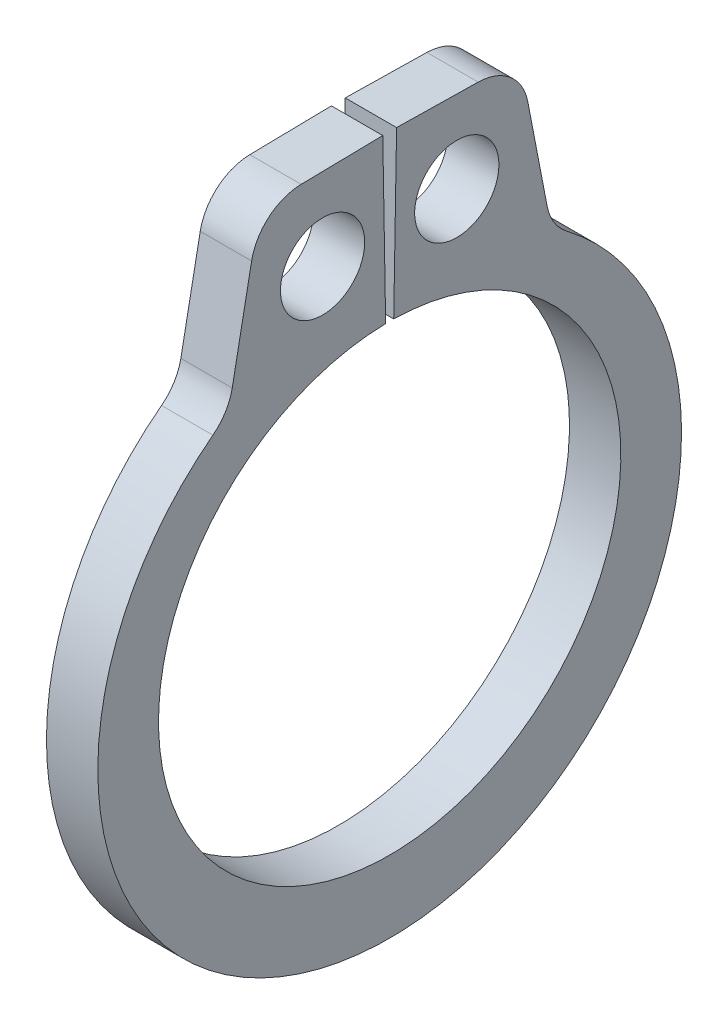
ISO-10303-21;
HEADER;
FILE_DESCRIPTION(('STEP AP214'),'2;1');
FILE_NAME('part.step','',(''),(''),'','','');
FILE_SCHEMA(('AUTOMOTIVE_DESIGN { 1 0 10303 214 1 1 1 1 }'));
ENDSEC;
DATA;
#1=APPLICATION_CONTEXT('core data for automotive mechanical design processes');
#2=APPLICATION_PROTOCOL_DEFINITION('international standard','automotive_design',2000,#1);
#3=PRODUCT_CONTEXT('',#1,'mechanical');
#4=PRODUCT('Part','Part','',(#3));
#5=PRODUCT_RELATED_PRODUCT_CATEGORY('part','',(#4));
#6=PRODUCT_DEFINITION_FORMATION('','',#4);
#7=PRODUCT_DEFINITION_CONTEXT('part definition',#1,'design');
#8=PRODUCT_DEFINITION('design','',#6,#7);
#9=PRODUCT_DEFINITION_SHAPE('','',#8);
#10=(LENGTH_UNIT() NAMED_UNIT(*) SI_UNIT(.MILLI.,.METRE.));
#11=(NAMED_UNIT(*) PLANE_ANGLE_UNIT() SI_UNIT($,.RADIAN.));
#12=(NAMED_UNIT(*) SI_UNIT($,.STERADIAN.) SOLID_ANGLE_UNIT());
#13=UNCERTAINTY_MEASURE_WITH_UNIT(LENGTH_MEASURE(1.E-05),#10,'distance_accuracy_value','');
#14=(GEOMETRIC_REPRESENTATION_CONTEXT(3) GLOBAL_UNCERTAINTY_ASSIGNED_CONTEXT((#13)) GLOBAL_UNIT_ASSIGNED_CONTEXT((#10,
#11,#12)) REPRESENTATION_CONTEXT('',''));
#15=CARTESIAN_POINT('',(0.,0.,0.));
#16=DIRECTION('',(0.,0.,1.));
#17=DIRECTION('',(1.,0.,0.));
#18=AXIS2_PLACEMENT_3D('',#15,#16,#17);
#19=CARTESIAN_POINT('',(0.3175,0.,0.));
#20=DIRECTION('',(1.,0.,0.));
#21=DIRECTION('',(0.,0.,-1.));
#22=AXIS2_PLACEMENT_3D('',#19,#20,#21);
#23=PLANE('',#22);
#24=CARTESIAN_POINT('',(0.3175,3.85961131348307,0.829485840043988));
#25=DIRECTION('',(1.,0.,0.));
#26=DIRECTION('',(0.,0.,-1.));
#27=AXIS2_PLACEMENT_3D('',#24,#25,#26);
#28=CIRCLE('',#27,0.5207);
#29=CARTESIAN_POINT('',(0.3175,3.85961131348307,0.308785840043987));
#30=VERTEX_POINT('',#29);
#31=EDGE_CURVE('E283',#30,#30,#28,.T.);
#32=ORIENTED_EDGE('',*,*,#31,.F.);
#33=EDGE_LOOP('',(#32));
#34=FACE_BOUND('',#33,.T.);
#35=DIRECTION('',(0.,-0.017452406437284,0.999847695156391));
#36=VECTOR('',#35,1.);
#37=CARTESIAN_POINT('',(0.3175,4.88875530546717,0.0853335412750982));
#38=LINE('',#37,#36);
#39=CARTESIAN_POINT('',(0.3175,4.88875530546717,0.0853335412750982));
#40=VERTEX_POINT('',#39);
#41=CARTESIAN_POINT('',(0.3175,4.87114314790032,1.09433337251506));
#42=VERTEX_POINT('',#41);
#43=EDGE_CURVE('E168',#40,#42,#38,.T.);
#44=ORIENTED_EDGE('',*,*,#43,.T.);
#45=CARTESIAN_POINT('',(0.3175,4.23623986147601,1.08325109442739));
#46=DIRECTION('',(1.,0.,0.));
#47=DIRECTION('',(0.,0.,-1.));
#48=AXIS2_PLACEMENT_3D('',#45,#46,#47);
#49=CIRCLE('',#48,0.635);
#50=CARTESIAN_POINT('',(0.3175,4.3566525704861,1.7067298667275));
#51=VERTEX_POINT('',#50);
#52=EDGE_CURVE('E224',#42,#51,#49,.T.);
#53=ORIENTED_EDGE('',*,*,#52,.T.);
#54=DIRECTION('',(0.,-0.981856334330881,0.189626313401714));
#55=VECTOR('',#54,1.);
#56=CARTESIAN_POINT('',(0.3175,4.86215783805675,1.60910142869344));
#57=LINE('',#56,#55);
#58=CARTESIAN_POINT('',(0.3175,3.11622073770559,1.94629497136839));
#59=VERTEX_POINT('',#58);
#60=EDGE_CURVE('E273',#51,#59,#57,.T.);
#61=ORIENTED_EDGE('',*,*,#60,.T.);
#62=CARTESIAN_POINT('',(0.3175,3.23663344671568,2.5697737436685));
#63=DIRECTION('',(1.,0.,0.));
#64=DIRECTION('',(0.,0.,-1.));
#65=AXIS2_PLACEMENT_3D('',#62,#63,#64);
#66=CIRCLE('',#65,0.635);
#67=CARTESIAN_POINT('',(0.3175,2.73137951372646,2.18513954966213));
#68=VERTEX_POINT('',#67);
#69=EDGE_CURVE('E234',#59,#68,#66,.F.);
#70=ORIENTED_EDGE('',*,*,#69,.T.);
#71=CARTESIAN_POINT('',(0.3175,-0.139011025651335,0.));
#72=DIRECTION('',(1.,0.,0.));
#73=DIRECTION('',(0.,0.,-1.));
#74=AXIS2_PLACEMENT_3D('',#71,#72,#73);
#75=CIRCLE('',#74,3.60748897434866);
#76=CARTESIAN_POINT('',(0.3175,2.73137951372646,-2.18513954966213));
#77=VERTEX_POINT('',#76);
#78=EDGE_CURVE('E262',#68,#77,#75,.T.);
#79=ORIENTED_EDGE('',*,*,#78,.T.);
#80=CARTESIAN_POINT('',(0.3175,3.23663344671568,-2.5697737436685));
#81=DIRECTION('',(1.,0.,0.));
#82=DIRECTION('',(0.,0.,-1.));
#83=AXIS2_PLACEMENT_3D('',#80,#81,#82);
#84=CIRCLE('',#83,0.635);
#85=CARTESIAN_POINT('',(0.3175,3.11622073770559,-1.94629497136839));
#86=VERTEX_POINT('',#85);
#87=EDGE_CURVE('E11',#77,#86,#84,.F.);
#88=ORIENTED_EDGE('',*,*,#87,.T.);
#89=DIRECTION('',(0.,0.981856334330881,0.189626313401714));
#90=VECTOR('',#89,1.);
#91=CARTESIAN_POINT('',(0.3175,4.86215783805675,-1.60910142869344));
#92=LINE('',#91,#90);
#93=CARTESIAN_POINT('',(0.3175,4.3566525704861,-1.7067298667275));
#94=VERTEX_POINT('',#93);
#95=EDGE_CURVE('E261',#86,#94,#92,.T.);
#96=ORIENTED_EDGE('',*,*,#95,.T.);
#97=CARTESIAN_POINT('',(0.3175,4.23623986147601,-1.08325109442739));
#98=DIRECTION('',(1.,0.,0.));
#99=DIRECTION('',(0.,0.,-1.));
#100=AXIS2_PLACEMENT_3D('',#97,#98,#99);
#101=CIRCLE('',#100,0.635);
#102=CARTESIAN_POINT('',(0.3175,4.87114314790032,-1.09433337251506));
#103=VERTEX_POINT('',#102);
#104=EDGE_CURVE('E62',#94,#103,#101,.T.);
#105=ORIENTED_EDGE('',*,*,#104,.T.);
#106=DIRECTION('',(0.,0.017452406437284,0.999847695156391));
#107=VECTOR('',#106,1.);
#108=CARTESIAN_POINT('',(0.3175,4.88875530546717,-0.0853335412750982));
#109=LINE('',#108,#107);
#110=CARTESIAN_POINT('',(0.3175,4.88875530546717,-0.0853335412750982));
#111=VERTEX_POINT('',#110);
#112=EDGE_CURVE('E267',#103,#111,#109,.T.);
#113=ORIENTED_EDGE('',*,*,#112,.T.);
#114=DIRECTION('',(0.,-0.999847695156391,0.0174524064372836));
#115=VECTOR('',#114,1.);
#116=CARTESIAN_POINT('',(0.3175,2.85706478890939,-0.0498702513945379));
#117=LINE('',#116,#115);
#118=CARTESIAN_POINT('',(0.3175,2.85706478890939,-0.0498702513945379));
#119=VERTEX_POINT('',#118);
#120=EDGE_CURVE('E174',#111,#119,#117,.T.);
#121=ORIENTED_EDGE('',*,*,#120,.T.);
#122=CARTESIAN_POINT('',(0.3175,0.,0.));
#123=DIRECTION('',(-1.,0.,0.));
#124=DIRECTION('',(0.,0.,-1.));
#125=AXIS2_PLACEMENT_3D('',#122,#123,#124);
#126=CIRCLE('',#125,2.8575);
#127=CARTESIAN_POINT('',(0.3175,2.85706478890939,0.0498702513945379));
#128=VERTEX_POINT('',#127);
#129=EDGE_CURVE('E169',#119,#128,#126,.T.);
#130=ORIENTED_EDGE('',*,*,#129,.T.);
#131=DIRECTION('',(0.,0.999847695156391,0.0174524064372836));
#132=VECTOR('',#131,1.);
#133=CARTESIAN_POINT('',(0.3175,2.85706478890939,0.0498702513945379));
#134=LINE('',#133,#132);
#135=EDGE_CURVE('E159',#128,#40,#134,.T.);
#136=ORIENTED_EDGE('',*,*,#135,.T.);
#137=EDGE_LOOP('',(#44,#53,#61,#70,#79,#88,#96,#105,#113,#121,#130,#136));
#138=FACE_BOUND('',#137,.T.);
#139=CARTESIAN_POINT('',(0.3175,3.85961131348307,-0.829485840043988));
#140=DIRECTION('',(1.,0.,0.));
#141=DIRECTION('',(0.,0.,-1.));
#142=AXIS2_PLACEMENT_3D('',#139,#140,#141);
#143=CIRCLE('',#142,0.5207);
#144=CARTESIAN_POINT('',(0.3175,3.85961131348307,-1.35018584004399));
#145=VERTEX_POINT('',#144);
#146=EDGE_CURVE('E318',#145,#145,#143,.T.);
#147=ORIENTED_EDGE('',*,*,#146,.F.);
#148=EDGE_LOOP('',(#147));
#149=FACE_BOUND('',#148,.T.);
#150=ADVANCED_FACE('F43',(#34,#138,#149),#23,.T.);
#151=CARTESIAN_POINT('',(-0.3175,0.,0.));
#152=DIRECTION('',(1.,0.,0.));
#153=DIRECTION('',(0.,0.,-1.));
#154=AXIS2_PLACEMENT_3D('',#151,#152,#153);
#155=PLANE('',#154);
#156=CARTESIAN_POINT('',(-0.3175,3.85961131348307,0.829485840043988));
#157=DIRECTION('',(1.,0.,0.));
#158=DIRECTION('',(0.,0.,-1.));
#159=AXIS2_PLACEMENT_3D('',#156,#157,#158);
#160=CIRCLE('',#159,0.5207);
#161=CARTESIAN_POINT('',(-0.3175,3.85961131348307,0.308785840043987));
#162=VERTEX_POINT('',#161);
#163=EDGE_CURVE('E314',#162,#162,#160,.T.);
#164=ORIENTED_EDGE('',*,*,#163,.T.);
#165=EDGE_LOOP('',(#164));
#166=FACE_BOUND('',#165,.T.);
#167=DIRECTION('',(0.,-0.981856334330881,0.189626313401714));
#168=VECTOR('',#167,1.);
#169=CARTESIAN_POINT('',(-0.3175,4.86215783805675,1.60910142869344));
#170=LINE('',#169,#168);
#171=CARTESIAN_POINT('',(-0.3175,4.3566525704861,1.7067298667275));
#172=VERTEX_POINT('',#171);
#173=CARTESIAN_POINT('',(-0.3175,3.11622073770559,1.94629497136839));
#174=VERTEX_POINT('',#173);
#175=EDGE_CURVE('E256',#172,#174,#170,.T.);
#176=ORIENTED_EDGE('',*,*,#175,.F.);
#177=CARTESIAN_POINT('',(-0.3175,4.23623986147601,1.08325109442739));
#178=DIRECTION('',(1.,0.,0.));
#179=DIRECTION('',(0.,0.,-1.));
#180=AXIS2_PLACEMENT_3D('',#177,#178,#179);
#181=CIRCLE('',#180,0.635);
#182=CARTESIAN_POINT('',(-0.3175,4.87114314790032,1.09433337251506));
#183=VERTEX_POINT('',#182);
#184=EDGE_CURVE('E217',#172,#183,#181,.F.);
#185=ORIENTED_EDGE('',*,*,#184,.T.);
#186=DIRECTION('',(0.,-0.017452406437284,0.999847695156391));
#187=VECTOR('',#186,1.);
#188=CARTESIAN_POINT('',(-0.3175,4.88875530546717,0.0853335412750982));
#189=LINE('',#188,#187);
#190=CARTESIAN_POINT('',(-0.3175,4.88875530546717,0.0853335412750982));
#191=VERTEX_POINT('',#190);
#192=EDGE_CURVE('E285',#191,#183,#189,.T.);
#193=ORIENTED_EDGE('',*,*,#192,.F.);
#194=DIRECTION('',(0.,0.999847695156391,0.0174524064372836));
#195=VECTOR('',#194,1.);
#196=CARTESIAN_POINT('',(-0.3175,2.85706478890939,0.0498702513945379));
#197=LINE('',#196,#195);
#198=CARTESIAN_POINT('',(-0.3175,2.85706478890939,0.0498702513945379));
#199=VERTEX_POINT('',#198);
#200=EDGE_CURVE('E282',#199,#191,#197,.T.);
#201=ORIENTED_EDGE('',*,*,#200,.F.);
#202=CARTESIAN_POINT('',(-0.3175,0.,0.));
#203=DIRECTION('',(-1.,0.,0.));
#204=DIRECTION('',(0.,0.,-1.));
#205=AXIS2_PLACEMENT_3D('',#202,#203,#204);
#206=CIRCLE('',#205,2.8575);
#207=CARTESIAN_POINT('',(-0.3175,2.85706478890939,-0.0498702513945379));
#208=VERTEX_POINT('',#207);
#209=EDGE_CURVE('E183',#208,#199,#206,.T.);
#210=ORIENTED_EDGE('',*,*,#209,.F.);
#211=DIRECTION('',(0.,-0.999847695156391,0.0174524064372836));
#212=VECTOR('',#211,1.);
#213=CARTESIAN_POINT('',(-0.3175,2.85706478890939,-0.0498702513945379));
#214=LINE('',#213,#212);
#215=CARTESIAN_POINT('',(-0.3175,4.88875530546717,-0.0853335412750982));
#216=VERTEX_POINT('',#215);
#217=EDGE_CURVE('E179',#216,#208,#214,.T.);
#218=ORIENTED_EDGE('',*,*,#217,.F.);
#219=DIRECTION('',(0.,0.017452406437284,0.999847695156391));
#220=VECTOR('',#219,1.);
#221=CARTESIAN_POINT('',(-0.3175,4.88875530546717,-0.0853335412750982));
#222=LINE('',#221,#220);
#223=CARTESIAN_POINT('',(-0.3175,4.87114314790032,-1.09433337251506));
#224=VERTEX_POINT('',#223);
#225=EDGE_CURVE('E293',#224,#216,#222,.T.);
#226=ORIENTED_EDGE('',*,*,#225,.F.);
#227=CARTESIAN_POINT('',(-0.3175,4.23623986147601,-1.08325109442739));
#228=DIRECTION('',(1.,0.,0.));
#229=DIRECTION('',(0.,0.,-1.));
#230=AXIS2_PLACEMENT_3D('',#227,#228,#229);
#231=CIRCLE('',#230,0.635);
#232=CARTESIAN_POINT('',(-0.3175,4.3566525704861,-1.7067298667275));
#233=VERTEX_POINT('',#232);
#234=EDGE_CURVE('E214',#224,#233,#231,.F.);
#235=ORIENTED_EDGE('',*,*,#234,.T.);
#236=DIRECTION('',(0.,0.981856334330881,0.189626313401714));
#237=VECTOR('',#236,1.);
#238=CARTESIAN_POINT('',(-0.3175,4.86215783805675,-1.60910142869344));
#239=LINE('',#238,#237);
#240=CARTESIAN_POINT('',(-0.3175,3.11622073770559,-1.94629497136839));
#241=VERTEX_POINT('',#240);
#242=EDGE_CURVE('E247',#241,#233,#239,.T.);
#243=ORIENTED_EDGE('',*,*,#242,.F.);
#244=CARTESIAN_POINT('',(-0.3175,3.23663344671568,-2.5697737436685));
#245=DIRECTION('',(1.,0.,0.));
#246=DIRECTION('',(0.,0.,-1.));
#247=AXIS2_PLACEMENT_3D('',#244,#245,#246);
#248=CIRCLE('',#247,0.635);
#249=CARTESIAN_POINT('',(-0.3175,2.73137951372646,-2.18513954966213));
#250=VERTEX_POINT('',#249);
#251=EDGE_CURVE('E52',#241,#250,#248,.T.);
#252=ORIENTED_EDGE('',*,*,#251,.T.);
#253=CARTESIAN_POINT('',(-0.3175,-0.139011025651335,0.));
#254=DIRECTION('',(1.,0.,0.));
#255=DIRECTION('',(0.,0.,-1.));
#256=AXIS2_PLACEMENT_3D('',#253,#254,#255);
#257=CIRCLE('',#256,3.60748897434866);
#258=CARTESIAN_POINT('',(-0.3175,2.73137951372646,2.18513954966213));
#259=VERTEX_POINT('',#258);
#260=EDGE_CURVE('E245',#259,#250,#257,.T.);
#261=ORIENTED_EDGE('',*,*,#260,.F.);
#262=CARTESIAN_POINT('',(-0.3175,3.23663344671568,2.5697737436685));
#263=DIRECTION('',(1.,0.,0.));
#264=DIRECTION('',(0.,0.,-1.));
#265=AXIS2_PLACEMENT_3D('',#262,#263,#264);
#266=CIRCLE('',#265,0.635);
#267=EDGE_CURVE('E231',#259,#174,#266,.T.);
#268=ORIENTED_EDGE('',*,*,#267,.T.);
#269=EDGE_LOOP('',(#176,#185,#193,#201,#210,#218,#226,#235,#243,#252,#261,#268));
#270=FACE_BOUND('',#269,.T.);
#271=CARTESIAN_POINT('',(-0.3175,3.85961131348307,-0.829485840043988));
#272=DIRECTION('',(1.,0.,0.));
#273=DIRECTION('',(0.,0.,-1.));
#274=AXIS2_PLACEMENT_3D('',#271,#272,#273);
#275=CIRCLE('',#274,0.5207);
#276=CARTESIAN_POINT('',(-0.3175,3.85961131348307,-1.35018584004399));
#277=VERTEX_POINT('',#276);
#278=EDGE_CURVE('E322',#277,#277,#275,.T.);
#279=ORIENTED_EDGE('',*,*,#278,.T.);
#280=EDGE_LOOP('',(#279));
#281=FACE_BOUND('',#280,.T.);
#282=ADVANCED_FACE('F243',(#166,#270,#281),#155,.F.);
#283=CARTESIAN_POINT('',(0.3175,0.,0.));
#284=DIRECTION('',(-1.,0.,0.));
#285=DIRECTION('',(0.,0.,1.));
#286=AXIS2_PLACEMENT_3D('',#283,#284,#285);
#287=CYLINDRICAL_SURFACE('',#286,2.8575);
#288=ORIENTED_EDGE('',*,*,#209,.T.);
#289=DIRECTION('',(-1.,0.,0.));
#290=VECTOR('',#289,1.);
#291=CARTESIAN_POINT('',(0.3175,2.85706478890939,0.0498702513945379));
#292=LINE('',#291,#290);
#293=EDGE_CURVE('E163',#128,#199,#292,.T.);
#294=ORIENTED_EDGE('',*,*,#293,.F.);
#295=ORIENTED_EDGE('',*,*,#129,.F.);
#296=DIRECTION('',(-1.,0.,0.));
#297=VECTOR('',#296,1.);
#298=CARTESIAN_POINT('',(0.3175,2.85706478890939,-0.0498702513945379));
#299=LINE('',#298,#297);
#300=EDGE_CURVE('E279',#119,#208,#299,.T.);
#301=ORIENTED_EDGE('',*,*,#300,.T.);
#302=EDGE_LOOP('',(#288,#294,#295,#301));
#303=FACE_BOUND('',#302,.T.);
#304=ADVANCED_FACE('F181',(#303),#287,.F.);
#305=CARTESIAN_POINT('',(0.3175,2.85706478890939,0.0498702513945379));
#306=DIRECTION('',(0.,-0.0174524064372836,0.999847695156391));
#307=DIRECTION('',(0.,-0.999847695156391,-0.0174524064372836));
#308=AXIS2_PLACEMENT_3D('',#305,#306,#307);
#309=PLANE('',#308);
#310=ORIENTED_EDGE('',*,*,#200,.T.);
#311=DIRECTION('',(-1.,0.,0.));
#312=VECTOR('',#311,1.);
#313=CARTESIAN_POINT('',(0.3175,4.88875530546717,0.0853335412750982));
#314=LINE('',#313,#312);
#315=EDGE_CURVE('E166',#40,#191,#314,.T.);
#316=ORIENTED_EDGE('',*,*,#315,.F.);
#317=ORIENTED_EDGE('',*,*,#135,.F.);
#318=ORIENTED_EDGE('',*,*,#293,.T.);
#319=EDGE_LOOP('',(#310,#316,#317,#318));
#320=FACE_BOUND('',#319,.T.);
#321=ADVANCED_FACE('F161',(#320),#309,.F.);
#322=CARTESIAN_POINT('',(0.3175,4.88875530546717,0.0853335412750982));
#323=DIRECTION('',(0.,-0.999847695156391,-0.017452406437284));
#324=DIRECTION('',(0.,0.017452406437284,-0.999847695156391));
#325=AXIS2_PLACEMENT_3D('',#322,#323,#324);
#326=PLANE('',#325);
#327=ORIENTED_EDGE('',*,*,#192,.T.);
#328=DIRECTION('',(-1.,0.,0.));
#329=VECTOR('',#328,1.);
#330=CARTESIAN_POINT('',(0.3175,4.87114314790032,1.09433337251506));
#331=LINE('',#330,#329);
#332=EDGE_CURVE('E73',#183,#42,#331,.F.);
#333=ORIENTED_EDGE('',*,*,#332,.T.);
#334=ORIENTED_EDGE('',*,*,#43,.F.);
#335=ORIENTED_EDGE('',*,*,#315,.T.);
#336=EDGE_LOOP('',(#327,#333,#334,#335));
#337=FACE_BOUND('',#336,.T.);
#338=ADVANCED_FACE('F307',(#337),#326,.F.);
#339=CARTESIAN_POINT('',(0.3175,4.86215783805675,1.60910142869344));
#340=DIRECTION('',(0.,-0.189626313401714,-0.981856334330881));
#341=DIRECTION('',(0.,0.981856334330881,-0.189626313401714));
#342=AXIS2_PLACEMENT_3D('',#339,#340,#341);
#343=PLANE('',#342);
#344=ORIENTED_EDGE('',*,*,#175,.T.);
#345=DIRECTION('',(1.,0.,0.));
#346=VECTOR('',#345,1.);
#347=CARTESIAN_POINT('',(0.3175,3.11622073770559,1.94629497136839));
#348=LINE('',#347,#346);
#349=EDGE_CURVE('E204',#174,#59,#348,.T.);
#350=ORIENTED_EDGE('',*,*,#349,.T.);
#351=ORIENTED_EDGE('',*,*,#60,.F.);
#352=DIRECTION('',(-1.,0.,0.));
#353=VECTOR('',#352,1.);
#354=CARTESIAN_POINT('',(0.3175,4.3566525704861,1.7067298667275));
#355=LINE('',#354,#353);
#356=EDGE_CURVE('E200',#51,#172,#355,.T.);
#357=ORIENTED_EDGE('',*,*,#356,.T.);
#358=EDGE_LOOP('',(#344,#350,#351,#357));
#359=FACE_BOUND('',#358,.T.);
#360=ADVANCED_FACE('F353',(#359),#343,.F.);
#361=CARTESIAN_POINT('',(0.3175,-0.139011025651335,0.));
#362=DIRECTION('',(-1.,0.,0.));
#363=DIRECTION('',(0.,0.,1.));
#364=AXIS2_PLACEMENT_3D('',#361,#362,#363);
#365=CYLINDRICAL_SURFACE('',#364,3.60748897434866);
#366=ORIENTED_EDGE('',*,*,#78,.F.);
#367=DIRECTION('',(-1.,0.,0.));
#368=VECTOR('',#367,1.);
#369=CARTESIAN_POINT('',(0.3175,2.73137951372646,2.18513954966213));
#370=LINE('',#369,#368);
#371=EDGE_CURVE('E190',#68,#259,#370,.T.);
#372=ORIENTED_EDGE('',*,*,#371,.T.);
#373=ORIENTED_EDGE('',*,*,#260,.T.);
#374=DIRECTION('',(-1.,0.,0.));
#375=VECTOR('',#374,1.);
#376=CARTESIAN_POINT('',(0.3175,2.73137951372646,-2.18513954966213));
#377=LINE('',#376,#375);
#378=EDGE_CURVE('E185',#250,#77,#377,.F.);
#379=ORIENTED_EDGE('',*,*,#378,.T.);
#380=EDGE_LOOP('',(#366,#372,#373,#379));
#381=FACE_BOUND('',#380,.T.);
#382=ADVANCED_FACE('F253',(#381),#365,.T.);
#383=CARTESIAN_POINT('',(0.3175,4.86215783805675,-1.60910142869344));
#384=DIRECTION('',(0.,-0.189626313401714,0.981856334330881));
#385=DIRECTION('',(0.,-0.981856334330881,-0.189626313401714));
#386=AXIS2_PLACEMENT_3D('',#383,#384,#385);
#387=PLANE('',#386);
#388=ORIENTED_EDGE('',*,*,#95,.F.);
#389=DIRECTION('',(1.,0.,0.));
#390=VECTOR('',#389,1.);
#391=CARTESIAN_POINT('',(-0.3175,3.11622073770559,-1.94629497136839));
#392=LINE('',#391,#390);
#393=EDGE_CURVE('E210',#86,#241,#392,.F.);
#394=ORIENTED_EDGE('',*,*,#393,.T.);
#395=ORIENTED_EDGE('',*,*,#242,.T.);
#396=DIRECTION('',(-1.,0.,0.));
#397=VECTOR('',#396,1.);
#398=CARTESIAN_POINT('',(0.3175,4.3566525704861,-1.7067298667275));
#399=LINE('',#398,#397);
#400=EDGE_CURVE('E207',#233,#94,#399,.F.);
#401=ORIENTED_EDGE('',*,*,#400,.T.);
#402=EDGE_LOOP('',(#388,#394,#395,#401));
#403=FACE_BOUND('',#402,.T.);
#404=ADVANCED_FACE('F264',(#403),#387,.F.);
#405=CARTESIAN_POINT('',(0.3175,4.88875530546717,-0.0853335412750982));
#406=DIRECTION('',(0.,-0.999847695156391,0.017452406437284));
#407=DIRECTION('',(0.,-0.017452406437284,-0.999847695156391));
#408=AXIS2_PLACEMENT_3D('',#405,#406,#407);
#409=PLANE('',#408);
#410=ORIENTED_EDGE('',*,*,#112,.F.);
#411=DIRECTION('',(-1.,0.,0.));
#412=VECTOR('',#411,1.);
#413=CARTESIAN_POINT('',(0.3175,4.87114314790032,-1.09433337251506));
#414=LINE('',#413,#412);
#415=EDGE_CURVE('E227',#103,#224,#414,.T.);
#416=ORIENTED_EDGE('',*,*,#415,.T.);
#417=ORIENTED_EDGE('',*,*,#225,.T.);
#418=DIRECTION('',(-1.,0.,0.));
#419=VECTOR('',#418,1.);
#420=CARTESIAN_POINT('',(0.3175,4.88875530546717,-0.0853335412750982));
#421=LINE('',#420,#419);
#422=EDGE_CURVE('E193',#111,#216,#421,.T.);
#423=ORIENTED_EDGE('',*,*,#422,.F.);
#424=EDGE_LOOP('',(#410,#416,#417,#423));
#425=FACE_BOUND('',#424,.T.);
#426=ADVANCED_FACE('F346',(#425),#409,.F.);
#427=CARTESIAN_POINT('',(0.3175,2.85706478890939,-0.0498702513945379));
#428=DIRECTION('',(0.,-0.0174524064372836,-0.999847695156391));
#429=DIRECTION('',(0.,0.999847695156391,-0.0174524064372836));
#430=AXIS2_PLACEMENT_3D('',#427,#428,#429);
#431=PLANE('',#430);
#432=ORIENTED_EDGE('',*,*,#217,.T.);
#433=ORIENTED_EDGE('',*,*,#300,.F.);
#434=ORIENTED_EDGE('',*,*,#120,.F.);
#435=ORIENTED_EDGE('',*,*,#422,.T.);
#436=EDGE_LOOP('',(#432,#433,#434,#435));
#437=FACE_BOUND('',#436,.T.);
#438=ADVANCED_FACE('F303',(#437),#431,.F.);
#439=CARTESIAN_POINT('',(0.3175,3.85961131348307,0.829485840043988));
#440=DIRECTION('',(-1.,0.,0.));
#441=DIRECTION('',(0.,0.,1.));
#442=AXIS2_PLACEMENT_3D('',#439,#440,#441);
#443=CYLINDRICAL_SURFACE('',#442,0.5207);
#444=ORIENTED_EDGE('',*,*,#31,.T.);
#445=EDGE_LOOP('',(#444));
#446=FACE_BOUND('',#445,.T.);
#447=ORIENTED_EDGE('',*,*,#163,.F.);
#448=EDGE_LOOP('',(#447));
#449=FACE_BOUND('',#448,.T.);
#450=ADVANCED_FACE('F341',(#446,#449),#443,.F.);
#451=CARTESIAN_POINT('',(0.3175,3.85961131348307,-0.829485840043988));
#452=DIRECTION('',(-1.,0.,0.));
#453=DIRECTION('',(0.,0.,1.));
#454=AXIS2_PLACEMENT_3D('',#451,#452,#453);
#455=CYLINDRICAL_SURFACE('',#454,0.5207);
#456=ORIENTED_EDGE('',*,*,#146,.T.);
#457=EDGE_LOOP('',(#456));
#458=FACE_BOUND('',#457,.T.);
#459=ORIENTED_EDGE('',*,*,#278,.F.);
#460=EDGE_LOOP('',(#459));
#461=FACE_BOUND('',#460,.T.);
#462=ADVANCED_FACE('F329',(#458,#461),#455,.F.);
#463=CARTESIAN_POINT('',(0.3175,3.23663344671568,2.5697737436685));
#464=DIRECTION('',(-1.,0.,0.));
#465=DIRECTION('',(0.,0.,1.));
#466=AXIS2_PLACEMENT_3D('',#463,#464,#465);
#467=CYLINDRICAL_SURFACE('',#466,0.635);
#468=ORIENTED_EDGE('',*,*,#69,.F.);
#469=ORIENTED_EDGE('',*,*,#349,.F.);
#470=ORIENTED_EDGE('',*,*,#267,.F.);
#471=ORIENTED_EDGE('',*,*,#371,.F.);
#472=EDGE_LOOP('',(#468,#469,#470,#471));
#473=FACE_BOUND('',#472,.T.);
#474=ADVANCED_FACE('F363',(#473),#467,.F.);
#475=CARTESIAN_POINT('',(0.3175,3.23663344671568,-2.5697737436685));
#476=DIRECTION('',(-1.,0.,0.));
#477=DIRECTION('',(0.,0.,1.));
#478=AXIS2_PLACEMENT_3D('',#475,#476,#477);
#479=CYLINDRICAL_SURFACE('',#478,0.635);
#480=ORIENTED_EDGE('',*,*,#87,.F.);
#481=ORIENTED_EDGE('',*,*,#378,.F.);
#482=ORIENTED_EDGE('',*,*,#251,.F.);
#483=ORIENTED_EDGE('',*,*,#393,.F.);
#484=EDGE_LOOP('',(#480,#481,#482,#483));
#485=FACE_BOUND('',#484,.T.);
#486=ADVANCED_FACE('F259',(#485),#479,.F.);
#487=CARTESIAN_POINT('',(0.3175,4.23623986147601,1.08325109442739));
#488=DIRECTION('',(-1.,0.,0.));
#489=DIRECTION('',(0.,0.,1.));
#490=AXIS2_PLACEMENT_3D('',#487,#488,#489);
#491=CYLINDRICAL_SURFACE('',#490,0.635);
#492=ORIENTED_EDGE('',*,*,#52,.F.);
#493=ORIENTED_EDGE('',*,*,#332,.F.);
#494=ORIENTED_EDGE('',*,*,#184,.F.);
#495=ORIENTED_EDGE('',*,*,#356,.F.);
#496=EDGE_LOOP('',(#492,#493,#494,#495));
#497=FACE_BOUND('',#496,.T.);
#498=ADVANCED_FACE('F368',(#497),#491,.T.);
#499=CARTESIAN_POINT('',(0.3175,4.23623986147601,-1.08325109442739));
#500=DIRECTION('',(-1.,0.,0.));
#501=DIRECTION('',(0.,0.,1.));
#502=AXIS2_PLACEMENT_3D('',#499,#500,#501);
#503=CYLINDRICAL_SURFACE('',#502,0.635);
#504=ORIENTED_EDGE('',*,*,#104,.F.);
#505=ORIENTED_EDGE('',*,*,#400,.F.);
#506=ORIENTED_EDGE('',*,*,#234,.F.);
#507=ORIENTED_EDGE('',*,*,#415,.F.);
#508=EDGE_LOOP('',(#504,#505,#506,#507));
#509=FACE_BOUND('',#508,.T.);
#510=ADVANCED_FACE('F45',(#509),#503,.T.);
#511=CLOSED_SHELL('',(#150,#282,#304,#321,#338,#360,#382,#404,#426,#438,#450,#462,#474,#486,
#498,#510));
#512=MANIFOLD_SOLID_BREP('B2',#511);
#513=ADVANCED_BREP_SHAPE_REPRESENTATION('',(#18,#512),#14);
#514=SHAPE_DEFINITION_REPRESENTATION(#9,#513);
ENDSEC;
END-ISO-10303-21;
